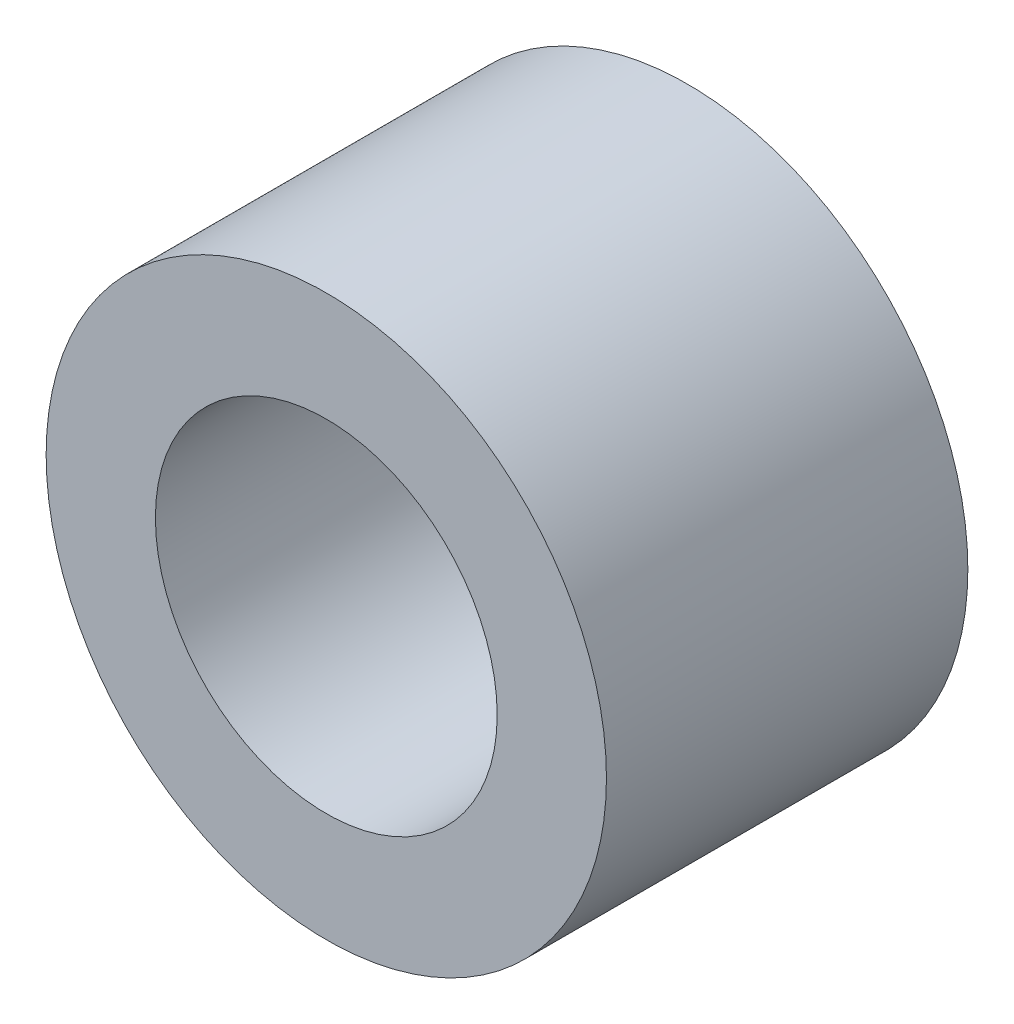
ISO-10303-21;
HEADER;
FILE_DESCRIPTION(('STEP AP214'),'2;1');
FILE_NAME('part.step','',(''),(''),'','','');
FILE_SCHEMA(('AUTOMOTIVE_DESIGN { 1 0 10303 214 1 1 1 1 }'));
ENDSEC;
DATA;
#1=APPLICATION_CONTEXT('core data for automotive mechanical design processes');
#2=APPLICATION_PROTOCOL_DEFINITION('international standard','automotive_design',2000,#1);
#3=PRODUCT_CONTEXT('',#1,'mechanical');
#4=PRODUCT('Part','Part','',(#3));
#5=PRODUCT_RELATED_PRODUCT_CATEGORY('part','',(#4));
#6=PRODUCT_DEFINITION_FORMATION('','',#4);
#7=PRODUCT_DEFINITION_CONTEXT('part definition',#1,'design');
#8=PRODUCT_DEFINITION('design','',#6,#7);
#9=PRODUCT_DEFINITION_SHAPE('','',#8);
#10=(LENGTH_UNIT() NAMED_UNIT(*) SI_UNIT(.MILLI.,.METRE.));
#11=(NAMED_UNIT(*) PLANE_ANGLE_UNIT() SI_UNIT($,.RADIAN.));
#12=(NAMED_UNIT(*) SI_UNIT($,.STERADIAN.) SOLID_ANGLE_UNIT());
#13=UNCERTAINTY_MEASURE_WITH_UNIT(LENGTH_MEASURE(1.E-05),#10,'distance_accuracy_value','');
#14=(GEOMETRIC_REPRESENTATION_CONTEXT(3) GLOBAL_UNCERTAINTY_ASSIGNED_CONTEXT((#13)) GLOBAL_UNIT_ASSIGNED_CONTEXT((#10,
#11,#12)) REPRESENTATION_CONTEXT('',''));
#15=CARTESIAN_POINT('',(0.,0.,0.));
#16=DIRECTION('',(0.,0.,1.));
#17=DIRECTION('',(1.,0.,0.));
#18=AXIS2_PLACEMENT_3D('',#15,#16,#17);
#19=CARTESIAN_POINT('',(0.,0.,6.45));
#20=DIRECTION('',(0.,0.,1.));
#21=DIRECTION('',(1.,0.,0.));
#22=AXIS2_PLACEMENT_3D('',#19,#20,#21);
#23=PLANE('',#22);
#24=CARTESIAN_POINT('',(0.,0.,6.45));
#25=DIRECTION('',(0.,0.,1.));
#26=DIRECTION('',(1.,0.,0.));
#27=AXIS2_PLACEMENT_3D('',#24,#25,#26);
#28=CIRCLE('',#27,10.);
#29=CARTESIAN_POINT('',(-10.,0.,6.45));
#30=VERTEX_POINT('',#29);
#31=EDGE_CURVE('E10',#30,#30,#28,.T.);
#32=ORIENTED_EDGE('',*,*,#31,.T.);
#33=EDGE_LOOP('',(#32));
#34=FACE_BOUND('',#33,.T.);
#35=CARTESIAN_POINT('',(0.,0.,6.45));
#36=DIRECTION('',(0.,0.,1.));
#37=DIRECTION('',(1.,0.,0.));
#38=AXIS2_PLACEMENT_3D('',#35,#36,#37);
#39=CIRCLE('',#38,6.1);
#40=CARTESIAN_POINT('',(-6.1,0.,6.45));
#41=VERTEX_POINT('',#40);
#42=EDGE_CURVE('E50',#41,#41,#39,.T.);
#43=ORIENTED_EDGE('',*,*,#42,.F.);
#44=EDGE_LOOP('',(#43));
#45=FACE_BOUND('',#44,.T.);
#46=ADVANCED_FACE('F37',(#34,#45),#23,.T.);
#47=CARTESIAN_POINT('',(0.,0.,-6.45));
#48=DIRECTION('',(0.,0.,1.));
#49=DIRECTION('',(1.,0.,0.));
#50=AXIS2_PLACEMENT_3D('',#47,#48,#49);
#51=PLANE('',#50);
#52=CARTESIAN_POINT('',(0.,0.,-6.45));
#53=DIRECTION('',(0.,0.,1.));
#54=DIRECTION('',(1.,0.,0.));
#55=AXIS2_PLACEMENT_3D('',#52,#53,#54);
#56=CIRCLE('',#55,10.);
#57=CARTESIAN_POINT('',(-10.,0.,-6.45));
#58=VERTEX_POINT('',#57);
#59=EDGE_CURVE('E41',#58,#58,#56,.T.);
#60=ORIENTED_EDGE('',*,*,#59,.F.);
#61=EDGE_LOOP('',(#60));
#62=FACE_BOUND('',#61,.T.);
#63=CARTESIAN_POINT('',(0.,0.,-6.45));
#64=DIRECTION('',(0.,0.,1.));
#65=DIRECTION('',(1.,0.,0.));
#66=AXIS2_PLACEMENT_3D('',#63,#64,#65);
#67=CIRCLE('',#66,6.1);
#68=CARTESIAN_POINT('',(-6.1,0.,-6.45));
#69=VERTEX_POINT('',#68);
#70=EDGE_CURVE('E52',#69,#69,#67,.T.);
#71=ORIENTED_EDGE('',*,*,#70,.T.);
#72=EDGE_LOOP('',(#71));
#73=FACE_BOUND('',#72,.T.);
#74=ADVANCED_FACE('F64',(#62,#73),#51,.F.);
#75=CARTESIAN_POINT('',(0.,0.,6.45));
#76=DIRECTION('',(0.,0.,-1.));
#77=DIRECTION('',(-1.,0.,0.));
#78=AXIS2_PLACEMENT_3D('',#75,#76,#77);
#79=CYLINDRICAL_SURFACE('',#78,10.);
#80=CARTESIAN_POINT('',(-10.,0.,6.45));
#81=CARTESIAN_POINT('',(-10.,0.,6.315625));
#82=CARTESIAN_POINT('',(-10.,0.,6.18125));
#83=CARTESIAN_POINT('',(-10.,0.,5.9125));
#84=CARTESIAN_POINT('',(-10.,0.,5.778125));
#85=CARTESIAN_POINT('',(-10.,0.,5.509375));
#86=CARTESIAN_POINT('',(-10.,0.,5.375));
#87=CARTESIAN_POINT('',(-10.,0.,5.10625));
#88=CARTESIAN_POINT('',(-10.,0.,4.971875));
#89=CARTESIAN_POINT('',(-10.,0.,4.703125));
#90=CARTESIAN_POINT('',(-10.,0.,4.56875));
#91=CARTESIAN_POINT('',(-10.,0.,4.3));
#92=CARTESIAN_POINT('',(-10.,0.,4.165625));
#93=CARTESIAN_POINT('',(-10.,0.,3.896875));
#94=CARTESIAN_POINT('',(-10.,0.,3.7625));
#95=CARTESIAN_POINT('',(-10.,0.,3.49375));
#96=CARTESIAN_POINT('',(-10.,0.,3.359375));
#97=CARTESIAN_POINT('',(-10.,0.,3.090625));
#98=CARTESIAN_POINT('',(-10.,0.,2.95625));
#99=CARTESIAN_POINT('',(-10.,0.,2.6875));
#100=CARTESIAN_POINT('',(-10.,0.,2.553125));
#101=CARTESIAN_POINT('',(-10.,0.,2.284375));
#102=CARTESIAN_POINT('',(-10.,0.,2.15));
#103=CARTESIAN_POINT('',(-10.,0.,1.88125));
#104=CARTESIAN_POINT('',(-10.,0.,1.746875));
#105=CARTESIAN_POINT('',(-10.,0.,1.478125));
#106=CARTESIAN_POINT('',(-10.,0.,1.34375));
#107=CARTESIAN_POINT('',(-10.,0.,1.075));
#108=CARTESIAN_POINT('',(-10.,0.,0.940625));
#109=CARTESIAN_POINT('',(-10.,0.,0.671875));
#110=CARTESIAN_POINT('',(-10.,0.,0.5375));
#111=CARTESIAN_POINT('',(-10.,0.,0.26875));
#112=CARTESIAN_POINT('',(-10.,0.,0.134375));
#113=CARTESIAN_POINT('',(-10.,0.,-0.134375));
#114=CARTESIAN_POINT('',(-10.,0.,-0.26875));
#115=CARTESIAN_POINT('',(-10.,0.,-0.5375));
#116=CARTESIAN_POINT('',(-10.,0.,-0.671875));
#117=CARTESIAN_POINT('',(-10.,0.,-0.940625));
#118=CARTESIAN_POINT('',(-10.,0.,-1.075));
#119=CARTESIAN_POINT('',(-10.,0.,-1.34375));
#120=CARTESIAN_POINT('',(-10.,0.,-1.478125));
#121=CARTESIAN_POINT('',(-10.,0.,-1.746875));
#122=CARTESIAN_POINT('',(-10.,0.,-1.88125));
#123=CARTESIAN_POINT('',(-10.,0.,-2.15));
#124=CARTESIAN_POINT('',(-10.,0.,-2.284375));
#125=CARTESIAN_POINT('',(-10.,0.,-2.553125));
#126=CARTESIAN_POINT('',(-10.,0.,-2.6875));
#127=CARTESIAN_POINT('',(-10.,0.,-2.95625));
#128=CARTESIAN_POINT('',(-10.,0.,-3.090625));
#129=CARTESIAN_POINT('',(-10.,0.,-3.359375));
#130=CARTESIAN_POINT('',(-10.,0.,-3.49375));
#131=CARTESIAN_POINT('',(-10.,0.,-3.7625));
#132=CARTESIAN_POINT('',(-10.,0.,-3.896875));
#133=CARTESIAN_POINT('',(-10.,0.,-4.165625));
#134=CARTESIAN_POINT('',(-10.,0.,-4.3));
#135=CARTESIAN_POINT('',(-10.,0.,-4.56875));
#136=CARTESIAN_POINT('',(-10.,0.,-4.703125));
#137=CARTESIAN_POINT('',(-10.,0.,-4.971875));
#138=CARTESIAN_POINT('',(-10.,0.,-5.10625));
#139=CARTESIAN_POINT('',(-10.,0.,-5.375));
#140=CARTESIAN_POINT('',(-10.,0.,-5.509375));
#141=CARTESIAN_POINT('',(-10.,0.,-5.778125));
#142=CARTESIAN_POINT('',(-10.,0.,-5.9125));
#143=CARTESIAN_POINT('',(-10.,0.,-6.18125));
#144=CARTESIAN_POINT('',(-10.,0.,-6.315625));
#145=CARTESIAN_POINT('',(-10.,0.,-6.45));
#146=B_SPLINE_CURVE_WITH_KNOTS('',3,(#80,#81,#82,#83,#84,#85,#86,#87,#88,#89,#90,#91,#92,#93,
#94,#95,#96,#97,#98,#99,#100,#101,#102,#103,#104,#105,#106,#107,#108,#109,#110,#111,#112,#113,
#114,#115,#116,#117,#118,#119,#120,#121,#122,#123,#124,#125,#126,#127,#128,#129,#130,#131,#132,
#133,#134,#135,#136,#137,#138,#139,#140,#141,#142,#143,#144,#145),.UNSPECIFIED.,.F.,.F.,(4,2,2,
2,2,2,2,2,2,2,2,2,2,2,2,2,2,2,2,2,2,2,2,2,2,2,2,2,2,2,2,2,4),(0.,0.403125000000001,
0.806250000000001,1.209375,1.6125,2.015625,2.41875,2.821875,3.225,3.628125,4.03125,4.434375,
4.8375,5.240625,5.64375,6.046875,6.45,6.853125,7.25625,7.659375,8.0625,8.465625,8.86875,
9.271875,9.675,10.078125,10.48125,10.884375,11.2875,11.690625,12.09375,12.496875,12.9),.UNSPECIFIED.);
#147=EDGE_CURVE('BSEAM39',#30,#58,#146,.T.);
#148=ORIENTED_EDGE('',*,*,#31,.F.);
#149=ORIENTED_EDGE('',*,*,#59,.T.);
#150=ORIENTED_EDGE('',*,*,#147,.T.);
#151=ORIENTED_EDGE('',*,*,#147,.F.);
#152=EDGE_LOOP('',(#148,#150,#149,#151));
#153=FACE_BOUND('',#152,.T.);
#154=ADVANCED_FACE('F39',(#153),#79,.T.);
#155=CARTESIAN_POINT('',(0.,0.,6.45));
#156=DIRECTION('',(0.,0.,-1.));
#157=DIRECTION('',(-1.,0.,0.));
#158=AXIS2_PLACEMENT_3D('',#155,#156,#157);
#159=CYLINDRICAL_SURFACE('',#158,6.1);
#160=CARTESIAN_POINT('',(-6.1,0.,6.45));
#161=CARTESIAN_POINT('',(-6.1,0.,6.315625));
#162=CARTESIAN_POINT('',(-6.1,0.,6.18125));
#163=CARTESIAN_POINT('',(-6.1,0.,5.9125));
#164=CARTESIAN_POINT('',(-6.1,0.,5.778125));
#165=CARTESIAN_POINT('',(-6.1,0.,5.509375));
#166=CARTESIAN_POINT('',(-6.1,0.,5.375));
#167=CARTESIAN_POINT('',(-6.1,0.,5.10625));
#168=CARTESIAN_POINT('',(-6.1,0.,4.971875));
#169=CARTESIAN_POINT('',(-6.1,0.,4.703125));
#170=CARTESIAN_POINT('',(-6.1,0.,4.56875));
#171=CARTESIAN_POINT('',(-6.1,0.,4.3));
#172=CARTESIAN_POINT('',(-6.1,0.,4.165625));
#173=CARTESIAN_POINT('',(-6.1,0.,3.896875));
#174=CARTESIAN_POINT('',(-6.1,0.,3.7625));
#175=CARTESIAN_POINT('',(-6.1,0.,3.49375));
#176=CARTESIAN_POINT('',(-6.1,0.,3.359375));
#177=CARTESIAN_POINT('',(-6.1,0.,3.090625));
#178=CARTESIAN_POINT('',(-6.1,0.,2.95625));
#179=CARTESIAN_POINT('',(-6.1,0.,2.6875));
#180=CARTESIAN_POINT('',(-6.1,0.,2.553125));
#181=CARTESIAN_POINT('',(-6.1,0.,2.284375));
#182=CARTESIAN_POINT('',(-6.1,0.,2.15));
#183=CARTESIAN_POINT('',(-6.1,0.,1.88125));
#184=CARTESIAN_POINT('',(-6.1,0.,1.746875));
#185=CARTESIAN_POINT('',(-6.1,0.,1.478125));
#186=CARTESIAN_POINT('',(-6.1,0.,1.34375));
#187=CARTESIAN_POINT('',(-6.1,0.,1.075));
#188=CARTESIAN_POINT('',(-6.1,0.,0.940624999999999));
#189=CARTESIAN_POINT('',(-6.1,0.,0.671874999999999));
#190=CARTESIAN_POINT('',(-6.1,0.,0.537499999999999));
#191=CARTESIAN_POINT('',(-6.1,0.,0.268749999999999));
#192=CARTESIAN_POINT('',(-6.1,0.,0.134374999999999));
#193=CARTESIAN_POINT('',(-6.1,0.,-0.134375000000001));
#194=CARTESIAN_POINT('',(-6.1,0.,-0.268750000000001));
#195=CARTESIAN_POINT('',(-6.1,0.,-0.537500000000001));
#196=CARTESIAN_POINT('',(-6.1,0.,-0.671875000000001));
#197=CARTESIAN_POINT('',(-6.1,0.,-0.940625000000001));
#198=CARTESIAN_POINT('',(-6.1,0.,-1.075));
#199=CARTESIAN_POINT('',(-6.1,0.,-1.34375));
#200=CARTESIAN_POINT('',(-6.1,0.,-1.478125));
#201=CARTESIAN_POINT('',(-6.1,0.,-1.746875));
#202=CARTESIAN_POINT('',(-6.1,0.,-1.88125));
#203=CARTESIAN_POINT('',(-6.1,0.,-2.15));
#204=CARTESIAN_POINT('',(-6.1,0.,-2.284375));
#205=CARTESIAN_POINT('',(-6.1,0.,-2.553125));
#206=CARTESIAN_POINT('',(-6.1,0.,-2.6875));
#207=CARTESIAN_POINT('',(-6.1,0.,-2.95625));
#208=CARTESIAN_POINT('',(-6.1,0.,-3.090625));
#209=CARTESIAN_POINT('',(-6.1,0.,-3.359375));
#210=CARTESIAN_POINT('',(-6.1,0.,-3.49375));
#211=CARTESIAN_POINT('',(-6.1,0.,-3.7625));
#212=CARTESIAN_POINT('',(-6.1,0.,-3.896875));
#213=CARTESIAN_POINT('',(-6.1,0.,-4.165625));
#214=CARTESIAN_POINT('',(-6.1,0.,-4.3));
#215=CARTESIAN_POINT('',(-6.1,0.,-4.56875));
#216=CARTESIAN_POINT('',(-6.1,0.,-4.703125));
#217=CARTESIAN_POINT('',(-6.1,0.,-4.971875));
#218=CARTESIAN_POINT('',(-6.1,0.,-5.10625));
#219=CARTESIAN_POINT('',(-6.1,0.,-5.375));
#220=CARTESIAN_POINT('',(-6.1,0.,-5.509375));
#221=CARTESIAN_POINT('',(-6.1,0.,-5.778125));
#222=CARTESIAN_POINT('',(-6.1,0.,-5.9125));
#223=CARTESIAN_POINT('',(-6.1,0.,-6.18125));
#224=CARTESIAN_POINT('',(-6.1,0.,-6.315625));
#225=CARTESIAN_POINT('',(-6.1,0.,-6.45));
#226=B_SPLINE_CURVE_WITH_KNOTS('',3,(#160,#161,#162,#163,#164,#165,#166,#167,#168,#169,#170,
#171,#172,#173,#174,#175,#176,#177,#178,#179,#180,#181,#182,#183,#184,#185,#186,#187,#188,#189,
#190,#191,#192,#193,#194,#195,#196,#197,#198,#199,#200,#201,#202,#203,#204,#205,#206,#207,#208,
#209,#210,#211,#212,#213,#214,#215,#216,#217,#218,#219,#220,#221,#222,#223,#224,#225),
.UNSPECIFIED.,.F.,.F.,(4,2,2,2,2,2,2,2,2,2,2,2,2,2,2,2,2,2,2,2,2,2,2,2,2,2,2,2,2,2,2,2,4),(0.,
0.403125,0.80625,1.209375,1.6125,2.015625,2.41875,2.821875,3.225,3.628125,4.03125,4.434375,
4.8375,5.240625,5.64375,6.046875,6.45,6.853125,7.25625,7.659375,8.0625,8.465625,8.86875,
9.271875,9.675,10.078125,10.48125,10.884375,11.2875,11.690625,12.09375,12.496875,12.9),.UNSPECIFIED.);
#227=EDGE_CURVE('BSEAM60',#41,#69,#226,.T.);
#228=ORIENTED_EDGE('',*,*,#42,.T.);
#229=ORIENTED_EDGE('',*,*,#70,.F.);
#230=ORIENTED_EDGE('',*,*,#227,.T.);
#231=ORIENTED_EDGE('',*,*,#227,.F.);
#232=EDGE_LOOP('',(#228,#230,#229,#231));
#233=FACE_BOUND('',#232,.T.);
#234=ADVANCED_FACE('F60',(#233),#159,.F.);
#235=CLOSED_SHELL('',(#46,#74,#154,#234));
#236=MANIFOLD_SOLID_BREP('B2',#235);
#237=ADVANCED_BREP_SHAPE_REPRESENTATION('',(#18,#236),#14);
#238=SHAPE_DEFINITION_REPRESENTATION(#9,#237);
ENDSEC;
END-ISO-10303-21;
